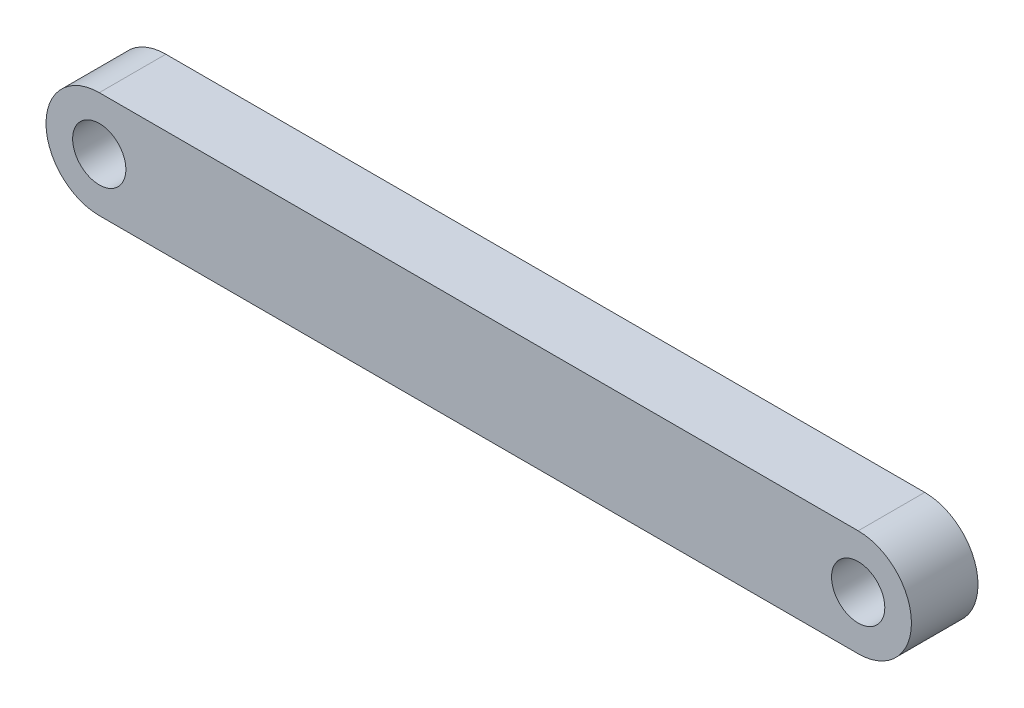
ISO-10303-21;
HEADER;
FILE_DESCRIPTION(('STEP AP214'),'2;1');
FILE_NAME('part.step','',(''),(''),'','','');
FILE_SCHEMA(('AUTOMOTIVE_DESIGN { 1 0 10303 214 1 1 1 1 }'));
ENDSEC;
DATA;
#1=APPLICATION_CONTEXT('core data for automotive mechanical design processes');
#2=APPLICATION_PROTOCOL_DEFINITION('international standard','automotive_design',2000,#1);
#3=PRODUCT_CONTEXT('',#1,'mechanical');
#4=PRODUCT('Part','Part','',(#3));
#5=PRODUCT_RELATED_PRODUCT_CATEGORY('part','',(#4));
#6=PRODUCT_DEFINITION_FORMATION('','',#4);
#7=PRODUCT_DEFINITION_CONTEXT('part definition',#1,'design');
#8=PRODUCT_DEFINITION('design','',#6,#7);
#9=PRODUCT_DEFINITION_SHAPE('','',#8);
#10=(LENGTH_UNIT() NAMED_UNIT(*) SI_UNIT(.MILLI.,.METRE.));
#11=(NAMED_UNIT(*) PLANE_ANGLE_UNIT() SI_UNIT($,.RADIAN.));
#12=(NAMED_UNIT(*) SI_UNIT($,.STERADIAN.) SOLID_ANGLE_UNIT());
#13=UNCERTAINTY_MEASURE_WITH_UNIT(LENGTH_MEASURE(1.E-05),#10,'distance_accuracy_value','');
#14=(GEOMETRIC_REPRESENTATION_CONTEXT(3) GLOBAL_UNCERTAINTY_ASSIGNED_CONTEXT((#13)) GLOBAL_UNIT_ASSIGNED_CONTEXT((#10,
#11,#12)) REPRESENTATION_CONTEXT('',''));
#15=CARTESIAN_POINT('',(0.,0.,0.));
#16=DIRECTION('',(0.,0.,1.));
#17=DIRECTION('',(1.,0.,0.));
#18=AXIS2_PLACEMENT_3D('',#15,#16,#17);
#19=CARTESIAN_POINT('',(0.,0.,2.5));
#20=DIRECTION('',(0.,0.,-1.));
#21=DIRECTION('',(-1.,0.,0.));
#22=AXIS2_PLACEMENT_3D('',#19,#20,#21);
#23=CYLINDRICAL_SURFACE('',#22,4.);
#24=CARTESIAN_POINT('',(0.,0.,-2.5));
#25=DIRECTION('',(0.,0.,1.));
#26=DIRECTION('',(1.,0.,0.));
#27=AXIS2_PLACEMENT_3D('',#24,#25,#26);
#28=CIRCLE('',#27,4.);
#29=CARTESIAN_POINT('',(0.,4.,-2.5));
#30=VERTEX_POINT('',#29);
#31=CARTESIAN_POINT('',(0.,-4.,-2.5));
#32=VERTEX_POINT('',#31);
#33=EDGE_CURVE('E111',#30,#32,#28,.T.);
#34=ORIENTED_EDGE('',*,*,#33,.T.);
#35=DIRECTION('',(0.,0.,-1.));
#36=VECTOR('',#35,1.);
#37=CARTESIAN_POINT('',(0.,-4.,2.5));
#38=LINE('',#37,#36);
#39=CARTESIAN_POINT('',(0.,-4.,2.5));
#40=VERTEX_POINT('',#39);
#41=EDGE_CURVE('E11',#40,#32,#38,.T.);
#42=ORIENTED_EDGE('',*,*,#41,.F.);
#43=CARTESIAN_POINT('',(0.,0.,2.5));
#44=DIRECTION('',(0.,0.,1.));
#45=DIRECTION('',(1.,0.,0.));
#46=AXIS2_PLACEMENT_3D('',#43,#44,#45);
#47=CIRCLE('',#46,4.);
#48=CARTESIAN_POINT('',(0.,4.,2.5));
#49=VERTEX_POINT('',#48);
#50=EDGE_CURVE('E95',#49,#40,#47,.T.);
#51=ORIENTED_EDGE('',*,*,#50,.F.);
#52=DIRECTION('',(0.,0.,-1.));
#53=VECTOR('',#52,1.);
#54=CARTESIAN_POINT('',(0.,4.,2.5));
#55=LINE('',#54,#53);
#56=EDGE_CURVE('E107',#49,#30,#55,.T.);
#57=ORIENTED_EDGE('',*,*,#56,.T.);
#58=EDGE_LOOP('',(#34,#42,#51,#57));
#59=FACE_BOUND('',#58,.T.);
#60=ADVANCED_FACE('F43',(#59),#23,.T.);
#61=CARTESIAN_POINT('',(0.,-4.,2.5));
#62=DIRECTION('',(0.,1.,0.));
#63=DIRECTION('',(0.,0.,1.));
#64=AXIS2_PLACEMENT_3D('',#61,#62,#63);
#65=PLANE('',#64);
#66=DIRECTION('',(1.,0.,0.));
#67=VECTOR('',#66,1.);
#68=CARTESIAN_POINT('',(0.,-4.,-2.5));
#69=LINE('',#68,#67);
#70=CARTESIAN_POINT('',(57.,-4.,-2.5));
#71=VERTEX_POINT('',#70);
#72=EDGE_CURVE('E100',#32,#71,#69,.T.);
#73=ORIENTED_EDGE('',*,*,#72,.T.);
#74=DIRECTION('',(0.,0.,-1.));
#75=VECTOR('',#74,1.);
#76=CARTESIAN_POINT('',(57.,-4.,2.5));
#77=LINE('',#76,#75);
#78=CARTESIAN_POINT('',(57.,-4.,2.5));
#79=VERTEX_POINT('',#78);
#80=EDGE_CURVE('E52',#79,#71,#77,.T.);
#81=ORIENTED_EDGE('',*,*,#80,.F.);
#82=DIRECTION('',(1.,0.,0.));
#83=VECTOR('',#82,1.);
#84=CARTESIAN_POINT('',(0.,-4.,2.5));
#85=LINE('',#84,#83);
#86=EDGE_CURVE('E90',#40,#79,#85,.T.);
#87=ORIENTED_EDGE('',*,*,#86,.F.);
#88=ORIENTED_EDGE('',*,*,#41,.T.);
#89=EDGE_LOOP('',(#73,#81,#87,#88));
#90=FACE_BOUND('',#89,.T.);
#91=ADVANCED_FACE('F99',(#90),#65,.F.);
#92=CARTESIAN_POINT('',(57.,0.,2.5));
#93=DIRECTION('',(0.,0.,-1.));
#94=DIRECTION('',(-1.,0.,0.));
#95=AXIS2_PLACEMENT_3D('',#92,#93,#94);
#96=CYLINDRICAL_SURFACE('',#95,4.);
#97=CARTESIAN_POINT('',(57.,0.,-2.5));
#98=DIRECTION('',(0.,0.,1.));
#99=DIRECTION('',(1.,0.,0.));
#100=AXIS2_PLACEMENT_3D('',#97,#98,#99);
#101=CIRCLE('',#100,4.);
#102=CARTESIAN_POINT('',(57.,4.,-2.5));
#103=VERTEX_POINT('',#102);
#104=EDGE_CURVE('E77',#71,#103,#101,.T.);
#105=ORIENTED_EDGE('',*,*,#104,.T.);
#106=DIRECTION('',(0.,0.,-1.));
#107=VECTOR('',#106,1.);
#108=CARTESIAN_POINT('',(57.,4.,2.5));
#109=LINE('',#108,#107);
#110=CARTESIAN_POINT('',(57.,4.,2.5));
#111=VERTEX_POINT('',#110);
#112=EDGE_CURVE('E102',#111,#103,#109,.T.);
#113=ORIENTED_EDGE('',*,*,#112,.F.);
#114=CARTESIAN_POINT('',(57.,0.,2.5));
#115=DIRECTION('',(0.,0.,1.));
#116=DIRECTION('',(1.,0.,0.));
#117=AXIS2_PLACEMENT_3D('',#114,#115,#116);
#118=CIRCLE('',#117,4.);
#119=EDGE_CURVE('E93',#79,#111,#118,.T.);
#120=ORIENTED_EDGE('',*,*,#119,.F.);
#121=ORIENTED_EDGE('',*,*,#80,.T.);
#122=EDGE_LOOP('',(#105,#113,#120,#121));
#123=FACE_BOUND('',#122,.T.);
#124=ADVANCED_FACE('F103',(#123),#96,.T.);
#125=CARTESIAN_POINT('',(0.,4.,2.5));
#126=DIRECTION('',(0.,-1.,0.));
#127=DIRECTION('',(0.,0.,-1.));
#128=AXIS2_PLACEMENT_3D('',#125,#126,#127);
#129=PLANE('',#128);
#130=DIRECTION('',(-1.,0.,0.));
#131=VECTOR('',#130,1.);
#132=CARTESIAN_POINT('',(0.,4.,-2.5));
#133=LINE('',#132,#131);
#134=EDGE_CURVE('E83',#103,#30,#133,.T.);
#135=ORIENTED_EDGE('',*,*,#134,.T.);
#136=ORIENTED_EDGE('',*,*,#56,.F.);
#137=DIRECTION('',(-1.,0.,0.));
#138=VECTOR('',#137,1.);
#139=CARTESIAN_POINT('',(0.,4.,2.5));
#140=LINE('',#139,#138);
#141=EDGE_CURVE('E60',#111,#49,#140,.T.);
#142=ORIENTED_EDGE('',*,*,#141,.F.);
#143=ORIENTED_EDGE('',*,*,#112,.T.);
#144=EDGE_LOOP('',(#135,#136,#142,#143));
#145=FACE_BOUND('',#144,.T.);
#146=ADVANCED_FACE('F125',(#145),#129,.F.);
#147=CARTESIAN_POINT('',(0.,0.,2.5));
#148=DIRECTION('',(0.,0.,1.));
#149=DIRECTION('',(1.,0.,0.));
#150=AXIS2_PLACEMENT_3D('',#147,#148,#149);
#151=PLANE('',#150);
#152=CARTESIAN_POINT('',(57.,0.,2.5));
#153=DIRECTION('',(0.,0.,1.));
#154=DIRECTION('',(1.,0.,0.));
#155=AXIS2_PLACEMENT_3D('',#152,#153,#154);
#156=CIRCLE('',#155,2.);
#157=CARTESIAN_POINT('',(59.,0.,2.5));
#158=VERTEX_POINT('',#157);
#159=EDGE_CURVE('E140',#158,#158,#156,.T.);
#160=ORIENTED_EDGE('',*,*,#159,.F.);
#161=EDGE_LOOP('',(#160));
#162=FACE_BOUND('',#161,.T.);
#163=CARTESIAN_POINT('',(0.,0.,2.5));
#164=DIRECTION('',(0.,0.,1.));
#165=DIRECTION('',(1.,0.,0.));
#166=AXIS2_PLACEMENT_3D('',#163,#164,#165);
#167=CIRCLE('',#166,2.);
#168=CARTESIAN_POINT('',(2.,0.,2.5));
#169=VERTEX_POINT('',#168);
#170=EDGE_CURVE('E136',#169,#169,#167,.T.);
#171=ORIENTED_EDGE('',*,*,#170,.F.);
#172=EDGE_LOOP('',(#171));
#173=FACE_BOUND('',#172,.T.);
#174=ORIENTED_EDGE('',*,*,#50,.T.);
#175=ORIENTED_EDGE('',*,*,#86,.T.);
#176=ORIENTED_EDGE('',*,*,#119,.T.);
#177=ORIENTED_EDGE('',*,*,#141,.T.);
#178=EDGE_LOOP('',(#174,#175,#176,#177));
#179=FACE_BOUND('',#178,.T.);
#180=ADVANCED_FACE('F91',(#162,#173,#179),#151,.T.);
#181=CARTESIAN_POINT('',(0.,0.,-2.5));
#182=DIRECTION('',(0.,0.,1.));
#183=DIRECTION('',(1.,0.,0.));
#184=AXIS2_PLACEMENT_3D('',#181,#182,#183);
#185=PLANE('',#184);
#186=CARTESIAN_POINT('',(57.,0.,-2.5));
#187=DIRECTION('',(0.,0.,1.));
#188=DIRECTION('',(1.,0.,0.));
#189=AXIS2_PLACEMENT_3D('',#186,#187,#188);
#190=CIRCLE('',#189,2.);
#191=CARTESIAN_POINT('',(59.,0.,-2.5));
#192=VERTEX_POINT('',#191);
#193=EDGE_CURVE('E115',#192,#192,#190,.T.);
#194=ORIENTED_EDGE('',*,*,#193,.T.);
#195=EDGE_LOOP('',(#194));
#196=FACE_BOUND('',#195,.T.);
#197=CARTESIAN_POINT('',(0.,0.,-2.5));
#198=DIRECTION('',(0.,0.,1.));
#199=DIRECTION('',(1.,0.,0.));
#200=AXIS2_PLACEMENT_3D('',#197,#198,#199);
#201=CIRCLE('',#200,2.);
#202=CARTESIAN_POINT('',(2.,0.,-2.5));
#203=VERTEX_POINT('',#202);
#204=EDGE_CURVE('E132',#203,#203,#201,.T.);
#205=ORIENTED_EDGE('',*,*,#204,.T.);
#206=EDGE_LOOP('',(#205));
#207=FACE_BOUND('',#206,.T.);
#208=ORIENTED_EDGE('',*,*,#33,.F.);
#209=ORIENTED_EDGE('',*,*,#134,.F.);
#210=ORIENTED_EDGE('',*,*,#104,.F.);
#211=ORIENTED_EDGE('',*,*,#72,.F.);
#212=EDGE_LOOP('',(#208,#209,#210,#211));
#213=FACE_BOUND('',#212,.T.);
#214=ADVANCED_FACE('F128',(#196,#207,#213),#185,.F.);
#215=CARTESIAN_POINT('',(0.,0.,-2.5));
#216=DIRECTION('',(0.,0.,1.));
#217=DIRECTION('',(1.,0.,0.));
#218=AXIS2_PLACEMENT_3D('',#215,#216,#217);
#219=CYLINDRICAL_SURFACE('',#218,2.);
#220=ORIENTED_EDGE('',*,*,#204,.F.);
#221=EDGE_LOOP('',(#220));
#222=FACE_BOUND('',#221,.T.);
#223=ORIENTED_EDGE('',*,*,#170,.T.);
#224=EDGE_LOOP('',(#223));
#225=FACE_BOUND('',#224,.T.);
#226=ADVANCED_FACE('F153',(#222,#225),#219,.F.);
#227=CARTESIAN_POINT('',(57.,0.,-2.5));
#228=DIRECTION('',(0.,0.,1.));
#229=DIRECTION('',(1.,0.,0.));
#230=AXIS2_PLACEMENT_3D('',#227,#228,#229);
#231=CYLINDRICAL_SURFACE('',#230,2.);
#232=ORIENTED_EDGE('',*,*,#193,.F.);
#233=EDGE_LOOP('',(#232));
#234=FACE_BOUND('',#233,.T.);
#235=ORIENTED_EDGE('',*,*,#159,.T.);
#236=EDGE_LOOP('',(#235));
#237=FACE_BOUND('',#236,.T.);
#238=ADVANCED_FACE('F150',(#234,#237),#231,.F.);
#239=CLOSED_SHELL('',(#60,#91,#124,#146,#180,#214,#226,#238));
#240=MANIFOLD_SOLID_BREP('B2',#239);
#241=ADVANCED_BREP_SHAPE_REPRESENTATION('',(#18,#240),#14);
#242=SHAPE_DEFINITION_REPRESENTATION(#9,#241);
ENDSEC;
END-ISO-10303-21;
